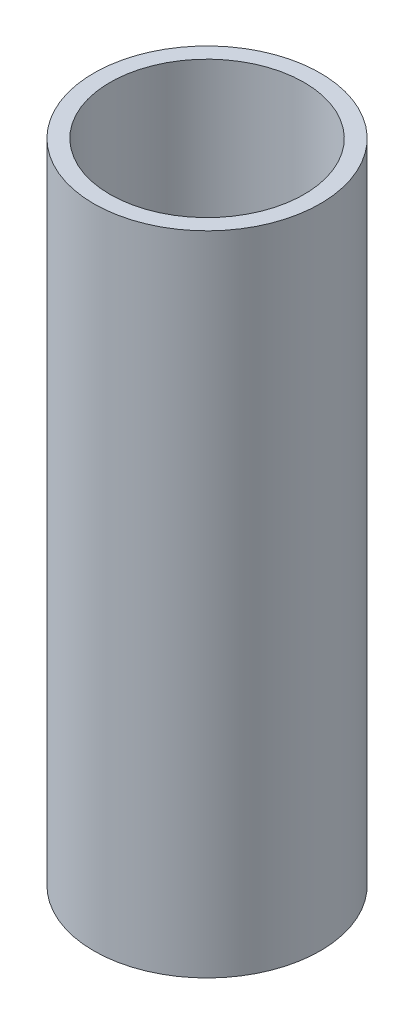
ISO-10303-21;
HEADER;
FILE_DESCRIPTION(('STEP AP214'),'2;1');
FILE_NAME('part.step','',(''),(''),'','','');
FILE_SCHEMA(('AUTOMOTIVE_DESIGN { 1 0 10303 214 1 1 1 1 }'));
ENDSEC;
DATA;
#1=APPLICATION_CONTEXT('core data for automotive mechanical design processes');
#2=APPLICATION_PROTOCOL_DEFINITION('international standard','automotive_design',2000,#1);
#3=PRODUCT_CONTEXT('',#1,'mechanical');
#4=PRODUCT('Part','Part','',(#3));
#5=PRODUCT_RELATED_PRODUCT_CATEGORY('part','',(#4));
#6=PRODUCT_DEFINITION_FORMATION('','',#4);
#7=PRODUCT_DEFINITION_CONTEXT('part definition',#1,'design');
#8=PRODUCT_DEFINITION('design','',#6,#7);
#9=PRODUCT_DEFINITION_SHAPE('','',#8);
#10=(LENGTH_UNIT() NAMED_UNIT(*) SI_UNIT(.MILLI.,.METRE.));
#11=(NAMED_UNIT(*) PLANE_ANGLE_UNIT() SI_UNIT($,.RADIAN.));
#12=(NAMED_UNIT(*) SI_UNIT($,.STERADIAN.) SOLID_ANGLE_UNIT());
#13=UNCERTAINTY_MEASURE_WITH_UNIT(LENGTH_MEASURE(1.E-05),#10,'distance_accuracy_value','');
#14=(GEOMETRIC_REPRESENTATION_CONTEXT(3) GLOBAL_UNCERTAINTY_ASSIGNED_CONTEXT((#13)) GLOBAL_UNIT_ASSIGNED_CONTEXT((#10,
#11,#12)) REPRESENTATION_CONTEXT('',''));
#15=CARTESIAN_POINT('',(0.,0.,0.));
#16=DIRECTION('',(0.,0.,1.));
#17=DIRECTION('',(1.,0.,0.));
#18=AXIS2_PLACEMENT_3D('',#15,#16,#17);
#19=CARTESIAN_POINT('',(0.,10.,0.));
#20=DIRECTION('',(0.,1.,0.));
#21=DIRECTION('',(0.,0.,1.));
#22=AXIS2_PLACEMENT_3D('',#19,#20,#21);
#23=PLANE('',#22);
#24=CARTESIAN_POINT('',(0.,10.,0.));
#25=DIRECTION('',(0.,1.,0.));
#26=DIRECTION('',(0.,0.,1.));
#27=AXIS2_PLACEMENT_3D('',#24,#25,#26);
#28=CIRCLE('',#27,1.75);
#29=CARTESIAN_POINT('',(0.,10.,1.75));
#30=VERTEX_POINT('',#29);
#31=EDGE_CURVE('E10',#30,#30,#28,.T.);
#32=ORIENTED_EDGE('',*,*,#31,.T.);
#33=EDGE_LOOP('',(#32));
#34=FACE_BOUND('',#33,.T.);
#35=CARTESIAN_POINT('',(0.,10.,0.));
#36=DIRECTION('',(0.,1.,0.));
#37=DIRECTION('',(0.,0.,1.));
#38=AXIS2_PLACEMENT_3D('',#35,#36,#37);
#39=CIRCLE('',#38,1.5);
#40=CARTESIAN_POINT('',(0.,10.,1.5));
#41=VERTEX_POINT('',#40);
#42=EDGE_CURVE('E52',#41,#41,#39,.T.);
#43=ORIENTED_EDGE('',*,*,#42,.F.);
#44=EDGE_LOOP('',(#43));
#45=FACE_BOUND('',#44,.T.);
#46=ADVANCED_FACE('F39',(#34,#45),#23,.T.);
#47=CARTESIAN_POINT('',(0.,0.,0.));
#48=DIRECTION('',(0.,1.,0.));
#49=DIRECTION('',(0.,0.,1.));
#50=AXIS2_PLACEMENT_3D('',#47,#48,#49);
#51=PLANE('',#50);
#52=CARTESIAN_POINT('',(0.,0.,0.));
#53=DIRECTION('',(0.,1.,0.));
#54=DIRECTION('',(0.,0.,1.));
#55=AXIS2_PLACEMENT_3D('',#52,#53,#54);
#56=CIRCLE('',#55,1.75);
#57=CARTESIAN_POINT('',(0.,0.,1.75));
#58=VERTEX_POINT('',#57);
#59=EDGE_CURVE('E43',#58,#58,#56,.T.);
#60=ORIENTED_EDGE('',*,*,#59,.F.);
#61=EDGE_LOOP('',(#60));
#62=FACE_BOUND('',#61,.T.);
#63=CARTESIAN_POINT('',(0.,0.,0.));
#64=DIRECTION('',(0.,1.,0.));
#65=DIRECTION('',(0.,0.,1.));
#66=AXIS2_PLACEMENT_3D('',#63,#64,#65);
#67=CIRCLE('',#66,1.5);
#68=CARTESIAN_POINT('',(0.,0.,1.5));
#69=VERTEX_POINT('',#68);
#70=EDGE_CURVE('E54',#69,#69,#67,.T.);
#71=ORIENTED_EDGE('',*,*,#70,.T.);
#72=EDGE_LOOP('',(#71));
#73=FACE_BOUND('',#72,.T.);
#74=ADVANCED_FACE('F66',(#62,#73),#51,.F.);
#75=CARTESIAN_POINT('',(0.,10.,0.));
#76=DIRECTION('',(0.,-1.,0.));
#77=DIRECTION('',(0.,0.,-1.));
#78=AXIS2_PLACEMENT_3D('',#75,#76,#77);
#79=CYLINDRICAL_SURFACE('',#78,1.75);
#80=ORIENTED_EDGE('',*,*,#31,.F.);
#81=EDGE_LOOP('',(#80));
#82=FACE_BOUND('',#81,.T.);
#83=ORIENTED_EDGE('',*,*,#59,.T.);
#84=EDGE_LOOP('',(#83));
#85=FACE_BOUND('',#84,.T.);
#86=ADVANCED_FACE('F41',(#82,#85),#79,.T.);
#87=CARTESIAN_POINT('',(0.,10.,0.));
#88=DIRECTION('',(0.,-1.,0.));
#89=DIRECTION('',(0.,0.,-1.));
#90=AXIS2_PLACEMENT_3D('',#87,#88,#89);
#91=CYLINDRICAL_SURFACE('',#90,1.5);
#92=ORIENTED_EDGE('',*,*,#42,.T.);
#93=EDGE_LOOP('',(#92));
#94=FACE_BOUND('',#93,.T.);
#95=ORIENTED_EDGE('',*,*,#70,.F.);
#96=EDGE_LOOP('',(#95));
#97=FACE_BOUND('',#96,.T.);
#98=ADVANCED_FACE('F62',(#94,#97),#91,.F.);
#99=CLOSED_SHELL('',(#46,#74,#86,#98));
#100=MANIFOLD_SOLID_BREP('B2',#99);
#101=ADVANCED_BREP_SHAPE_REPRESENTATION('',(#18,#100),#14);
#102=SHAPE_DEFINITION_REPRESENTATION(#9,#101);
ENDSEC;
END-ISO-10303-21;
